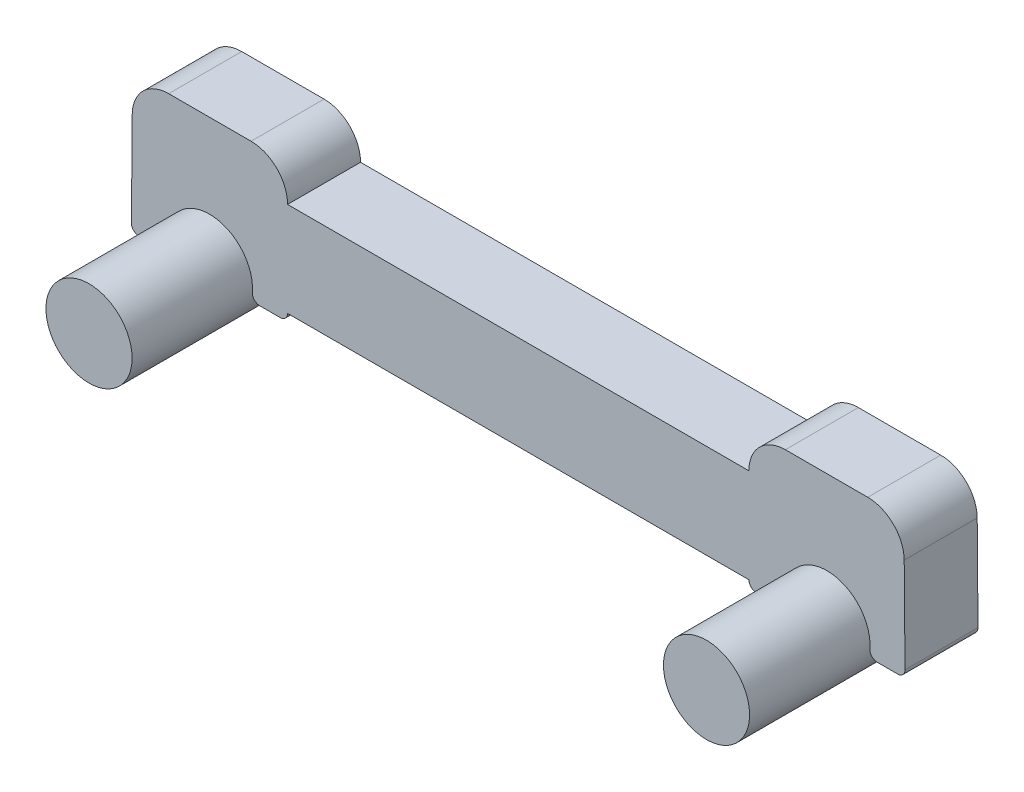
ISO-10303-21;
HEADER;
FILE_DESCRIPTION(('STEP AP214'),'2;1');
FILE_NAME('part.step','',(''),(''),'','','');
FILE_SCHEMA(('AUTOMOTIVE_DESIGN { 1 0 10303 214 1 1 1 1 }'));
ENDSEC;
DATA;
#1=APPLICATION_CONTEXT('core data for automotive mechanical design processes');
#2=APPLICATION_PROTOCOL_DEFINITION('international standard','automotive_design',2000,#1);
#3=PRODUCT_CONTEXT('',#1,'mechanical');
#4=PRODUCT('Part','Part','',(#3));
#5=PRODUCT_RELATED_PRODUCT_CATEGORY('part','',(#4));
#6=PRODUCT_DEFINITION_FORMATION('','',#4);
#7=PRODUCT_DEFINITION_CONTEXT('part definition',#1,'design');
#8=PRODUCT_DEFINITION('design','',#6,#7);
#9=PRODUCT_DEFINITION_SHAPE('','',#8);
#10=(LENGTH_UNIT() NAMED_UNIT(*) SI_UNIT(.MILLI.,.METRE.));
#11=(NAMED_UNIT(*) PLANE_ANGLE_UNIT() SI_UNIT($,.RADIAN.));
#12=(NAMED_UNIT(*) SI_UNIT($,.STERADIAN.) SOLID_ANGLE_UNIT());
#13=UNCERTAINTY_MEASURE_WITH_UNIT(LENGTH_MEASURE(1.E-05),#10,'distance_accuracy_value','');
#14=(GEOMETRIC_REPRESENTATION_CONTEXT(3) GLOBAL_UNCERTAINTY_ASSIGNED_CONTEXT((#13)) GLOBAL_UNIT_ASSIGNED_CONTEXT((#10,
#11,#12)) REPRESENTATION_CONTEXT('',''));
#15=CARTESIAN_POINT('',(0.,0.,0.));
#16=DIRECTION('',(0.,0.,1.));
#17=DIRECTION('',(1.,0.,0.));
#18=AXIS2_PLACEMENT_3D('',#15,#16,#17);
#19=CARTESIAN_POINT('',(0.,0.,6.731));
#20=DIRECTION('',(0.,0.,-1.));
#21=DIRECTION('',(-1.,0.,0.));
#22=AXIS2_PLACEMENT_3D('',#19,#20,#21);
#23=CYLINDRICAL_SURFACE('',#22,1.4986);
#24=CARTESIAN_POINT('',(0.,0.,2.54));
#25=DIRECTION('',(0.,0.,1.));
#26=DIRECTION('',(1.,0.,0.));
#27=AXIS2_PLACEMENT_3D('',#24,#25,#26);
#28=CIRCLE('',#27,1.4986);
#29=CARTESIAN_POINT('',(1.49422208879911,-0.114465319397793,2.54));
#30=VERTEX_POINT('',#29);
#31=CARTESIAN_POINT('',(-1.49422208879911,-0.114465319397793,2.54));
#32=VERTEX_POINT('',#31);
#33=EDGE_CURVE('E64',#30,#32,#28,.T.);
#34=ORIENTED_EDGE('',*,*,#33,.T.);
#35=DIRECTION('',(0.,0.,-1.));
#36=VECTOR('',#35,1.);
#37=CARTESIAN_POINT('',(-1.49422208879911,-0.114465319397793,2.54));
#38=LINE('',#37,#36);
#39=CARTESIAN_POINT('',(-1.49422208879911,-0.114465319397793,0.));
#40=VERTEX_POINT('',#39);
#41=EDGE_CURVE('E435',#32,#40,#38,.T.);
#42=ORIENTED_EDGE('',*,*,#41,.T.);
#43=CARTESIAN_POINT('',(0.,0.,0.));
#44=DIRECTION('',(0.,0.,1.));
#45=DIRECTION('',(1.,0.,0.));
#46=AXIS2_PLACEMENT_3D('',#43,#44,#45);
#47=CIRCLE('',#46,1.4986);
#48=CARTESIAN_POINT('',(1.49422208879911,-0.114465319397793,0.));
#49=VERTEX_POINT('',#48);
#50=EDGE_CURVE('E48',#40,#49,#47,.T.);
#51=ORIENTED_EDGE('',*,*,#50,.T.);
#52=DIRECTION('',(0.,0.,-1.));
#53=VECTOR('',#52,1.);
#54=CARTESIAN_POINT('',(1.49422208879911,-0.114465319397793,2.54));
#55=LINE('',#54,#53);
#56=EDGE_CURVE('E60',#30,#49,#55,.T.);
#57=ORIENTED_EDGE('',*,*,#56,.F.);
#58=EDGE_LOOP('',(#34,#42,#51,#57));
#59=FACE_BOUND('',#58,.T.);
#60=CARTESIAN_POINT('',(0.,0.,6.731));
#61=DIRECTION('',(0.,0.,1.));
#62=DIRECTION('',(1.,0.,0.));
#63=AXIS2_PLACEMENT_3D('',#60,#61,#62);
#64=CIRCLE('',#63,1.4986);
#65=CARTESIAN_POINT('',(1.4986,0.,6.731));
#66=VERTEX_POINT('',#65);
#67=EDGE_CURVE('E11',#66,#66,#64,.T.);
#68=ORIENTED_EDGE('',*,*,#67,.F.);
#69=EDGE_LOOP('',(#68));
#70=FACE_BOUND('',#69,.T.);
#71=ADVANCED_FACE('F45',(#59,#70),#23,.T.);
#72=CARTESIAN_POINT('',(0.,0.,6.731));
#73=DIRECTION('',(0.,0.,1.));
#74=DIRECTION('',(1.,0.,0.));
#75=AXIS2_PLACEMENT_3D('',#72,#73,#74);
#76=PLANE('',#75);
#77=ORIENTED_EDGE('',*,*,#67,.T.);
#78=EDGE_LOOP('',(#77));
#79=FACE_BOUND('',#78,.T.);
#80=ADVANCED_FACE('F563',(#79),#76,.T.);
#81=CARTESIAN_POINT('',(0.,0.,0.));
#82=DIRECTION('',(0.,0.,1.));
#83=DIRECTION('',(1.,0.,0.));
#84=AXIS2_PLACEMENT_3D('',#81,#82,#83);
#85=PLANE('',#84);
#86=ORIENTED_EDGE('',*,*,#50,.F.);
#87=CARTESIAN_POINT('',(-1.7474800699515,-0.133866220990639,0.));
#88=DIRECTION('',(0.,0.,-1.));
#89=DIRECTION('',(1.,0.,0.));
#90=AXIS2_PLACEMENT_3D('',#87,#88,#89);
#91=CIRCLE('',#90,0.254);
#92=CARTESIAN_POINT('',(-1.7474800699515,-0.387866220990639,0.));
#93=VERTEX_POINT('',#92);
#94=EDGE_CURVE('E422',#40,#93,#91,.T.);
#95=ORIENTED_EDGE('',*,*,#94,.T.);
#96=DIRECTION('',(-1.,0.,0.));
#97=VECTOR('',#96,1.);
#98=CARTESIAN_POINT('',(-1.7474800699515,-0.387866220990639,0.));
#99=LINE('',#98,#97);
#100=CARTESIAN_POINT('',(-2.46140392253097,-0.387866220990639,0.));
#101=VERTEX_POINT('',#100);
#102=EDGE_CURVE('E355',#93,#101,#99,.T.);
#103=ORIENTED_EDGE('',*,*,#102,.T.);
#104=CARTESIAN_POINT('',(-2.46140392253097,-0.133866220990639,0.));
#105=DIRECTION('',(0.,0.,-1.));
#106=DIRECTION('',(-1.,0.,0.));
#107=AXIS2_PLACEMENT_3D('',#104,#105,#106);
#108=CIRCLE('',#107,0.254);
#109=CARTESIAN_POINT('',(-2.71539504531815,-0.131742651988495,0.));
#110=VERTEX_POINT('',#109);
#111=EDGE_CURVE('E349',#101,#110,#108,.T.);
#112=ORIENTED_EDGE('',*,*,#111,.T.);
#113=DIRECTION('',(0.00836050788245017,0.999965050343235,0.));
#114=VECTOR('',#113,1.);
#115=CARTESIAN_POINT('',(-2.71539504531815,-0.131742651988495,0.));
#116=LINE('',#115,#114);
#117=CARTESIAN_POINT('',(-2.68787162170007,3.1602178450107,0.));
#118=VERTEX_POINT('',#117);
#119=EDGE_CURVE('E394',#110,#118,#116,.T.);
#120=ORIENTED_EDGE('',*,*,#119,.T.);
#121=CARTESIAN_POINT('',(-1.41791600776416,3.1496,0.));
#122=DIRECTION('',(0.,0.,-1.));
#123=DIRECTION('',(1.,0.,0.));
#124=AXIS2_PLACEMENT_3D('',#121,#122,#123);
#125=CIRCLE('',#124,1.27);
#126=CARTESIAN_POINT('',(-1.41791600776415,4.4196,0.));
#127=VERTEX_POINT('',#126);
#128=EDGE_CURVE('E398',#118,#127,#125,.T.);
#129=ORIENTED_EDGE('',*,*,#128,.T.);
#130=DIRECTION('',(1.,0.,0.));
#131=VECTOR('',#130,1.);
#132=CARTESIAN_POINT('',(1.44753644327679,4.4196,0.));
#133=LINE('',#132,#131);
#134=CARTESIAN_POINT('',(1.44753644327679,4.4196,0.));
#135=VERTEX_POINT('',#134);
#136=EDGE_CURVE('E402',#127,#135,#133,.T.);
#137=ORIENTED_EDGE('',*,*,#136,.T.);
#138=CARTESIAN_POINT('',(1.4475364432768,3.1496,0.));
#139=DIRECTION('',(0.,0.,-1.));
#140=DIRECTION('',(1.,0.,0.));
#141=AXIS2_PLACEMENT_3D('',#138,#139,#140);
#142=CIRCLE('',#141,1.27);
#143=CARTESIAN_POINT('',(2.7175364432768,3.14959999999999,0.));
#144=VERTEX_POINT('',#143);
#145=EDGE_CURVE('E406',#135,#144,#142,.T.);
#146=ORIENTED_EDGE('',*,*,#145,.T.);
#147=DIRECTION('',(-1.,0.,0.));
#148=VECTOR('',#147,1.);
#149=CARTESIAN_POINT('',(10.7439364432768,3.14959999999999,0.));
#150=LINE('',#149,#148);
#151=CARTESIAN_POINT('',(18.7703364432768,3.14959999999999,0.));
#152=VERTEX_POINT('',#151);
#153=EDGE_CURVE('E345',#152,#144,#150,.T.);
#154=ORIENTED_EDGE('',*,*,#153,.F.);
#155=CARTESIAN_POINT('',(20.0403364432768,3.1496,0.));
#156=DIRECTION('',(0.,0.,1.));
#157=DIRECTION('',(-1.,0.,0.));
#158=AXIS2_PLACEMENT_3D('',#155,#156,#157);
#159=CIRCLE('',#158,1.27);
#160=CARTESIAN_POINT('',(20.0403364432768,4.4196,0.));
#161=VERTEX_POINT('',#160);
#162=EDGE_CURVE('E276',#161,#152,#159,.T.);
#163=ORIENTED_EDGE('',*,*,#162,.F.);
#164=DIRECTION('',(-1.,0.,0.));
#165=VECTOR('',#164,1.);
#166=CARTESIAN_POINT('',(20.0403364432768,4.4196,0.));
#167=LINE('',#166,#165);
#168=CARTESIAN_POINT('',(22.9057888943177,4.4196,0.));
#169=VERTEX_POINT('',#168);
#170=EDGE_CURVE('E272',#169,#161,#167,.T.);
#171=ORIENTED_EDGE('',*,*,#170,.F.);
#172=CARTESIAN_POINT('',(22.9057888943177,3.1496,0.));
#173=DIRECTION('',(0.,0.,1.));
#174=DIRECTION('',(-1.,0.,0.));
#175=AXIS2_PLACEMENT_3D('',#172,#173,#174);
#176=CIRCLE('',#175,1.27);
#177=CARTESIAN_POINT('',(24.1757445082537,3.1602178450107,0.));
#178=VERTEX_POINT('',#177);
#179=EDGE_CURVE('E268',#178,#169,#176,.T.);
#180=ORIENTED_EDGE('',*,*,#179,.F.);
#181=DIRECTION('',(-0.00836050788245017,0.999965050343235,0.));
#182=VECTOR('',#181,1.);
#183=CARTESIAN_POINT('',(24.2032679318717,-0.131742651988495,0.));
#184=LINE('',#183,#182);
#185=CARTESIAN_POINT('',(24.2032679318717,-0.131742651988495,0.));
#186=VERTEX_POINT('',#185);
#187=EDGE_CURVE('E264',#186,#178,#184,.T.);
#188=ORIENTED_EDGE('',*,*,#187,.F.);
#189=CARTESIAN_POINT('',(23.9492768090846,-0.133866220990639,0.));
#190=DIRECTION('',(0.,0.,1.));
#191=DIRECTION('',(1.,0.,0.));
#192=AXIS2_PLACEMENT_3D('',#189,#190,#191);
#193=CIRCLE('',#192,0.254);
#194=CARTESIAN_POINT('',(23.9492768090846,-0.387866220990639,0.));
#195=VERTEX_POINT('',#194);
#196=EDGE_CURVE('E260',#195,#186,#193,.T.);
#197=ORIENTED_EDGE('',*,*,#196,.F.);
#198=DIRECTION('',(1.,0.,0.));
#199=VECTOR('',#198,1.);
#200=CARTESIAN_POINT('',(23.2353529565051,-0.387866220990639,0.));
#201=LINE('',#200,#199);
#202=CARTESIAN_POINT('',(23.2353529565051,-0.387866220990639,0.));
#203=VERTEX_POINT('',#202);
#204=EDGE_CURVE('E294',#203,#195,#201,.T.);
#205=ORIENTED_EDGE('',*,*,#204,.F.);
#206=CARTESIAN_POINT('',(23.2353529565051,-0.133866220990639,0.));
#207=DIRECTION('',(0.,0.,1.));
#208=DIRECTION('',(-1.,0.,0.));
#209=AXIS2_PLACEMENT_3D('',#206,#207,#208);
#210=CIRCLE('',#209,0.254);
#211=CARTESIAN_POINT('',(22.9820949753527,-0.114465319397793,0.));
#212=VERTEX_POINT('',#211);
#213=EDGE_CURVE('E290',#212,#203,#210,.T.);
#214=ORIENTED_EDGE('',*,*,#213,.F.);
#215=CARTESIAN_POINT('',(21.4878728865536,0.,0.));
#216=DIRECTION('',(0.,0.,-1.));
#217=DIRECTION('',(-1.,0.,0.));
#218=AXIS2_PLACEMENT_3D('',#215,#216,#217);
#219=CIRCLE('',#218,1.4986);
#220=CARTESIAN_POINT('',(19.9936507977545,-0.114465319397793,0.));
#221=VERTEX_POINT('',#220);
#222=EDGE_CURVE('E302',#212,#221,#219,.T.);
#223=ORIENTED_EDGE('',*,*,#222,.T.);
#224=CARTESIAN_POINT('',(19.7403928166021,-0.133866220990639,0.));
#225=DIRECTION('',(0.,0.,1.));
#226=DIRECTION('',(1.,0.,0.));
#227=AXIS2_PLACEMENT_3D('',#224,#225,#226);
#228=CIRCLE('',#227,0.254);
#229=CARTESIAN_POINT('',(19.7403928166021,-0.387866220990639,0.));
#230=VERTEX_POINT('',#229);
#231=EDGE_CURVE('E287',#230,#221,#228,.T.);
#232=ORIENTED_EDGE('',*,*,#231,.F.);
#233=DIRECTION('',(1.,0.,0.));
#234=VECTOR('',#233,1.);
#235=CARTESIAN_POINT('',(19.7403928166021,-0.387866220990639,0.));
#236=LINE('',#235,#234);
#237=CARTESIAN_POINT('',(19.0243364432768,-0.387866220990639,0.));
#238=VERTEX_POINT('',#237);
#239=EDGE_CURVE('E283',#238,#230,#236,.T.);
#240=ORIENTED_EDGE('',*,*,#239,.F.);
#241=CARTESIAN_POINT('',(19.0243364432768,-0.133866220990639,0.));
#242=DIRECTION('',(0.,0.,1.));
#243=DIRECTION('',(-1.,0.,0.));
#244=AXIS2_PLACEMENT_3D('',#241,#242,#243);
#245=CIRCLE('',#244,0.254);
#246=CARTESIAN_POINT('',(18.7703364432768,-0.133866220990639,0.));
#247=VERTEX_POINT('',#246);
#248=EDGE_CURVE('E280',#247,#238,#245,.T.);
#249=ORIENTED_EDGE('',*,*,#248,.F.);
#250=DIRECTION('',(-1.,0.,0.));
#251=VECTOR('',#250,1.);
#252=CARTESIAN_POINT('',(10.7439364432768,-0.133866220990639,0.));
#253=LINE('',#252,#251);
#254=CARTESIAN_POINT('',(2.7175364432768,-0.133866220990639,0.));
#255=VERTEX_POINT('',#254);
#256=EDGE_CURVE('E219',#247,#255,#253,.T.);
#257=ORIENTED_EDGE('',*,*,#256,.T.);
#258=CARTESIAN_POINT('',(2.4635364432768,-0.133866220990639,0.));
#259=DIRECTION('',(0.,0.,-1.));
#260=DIRECTION('',(1.,0.,0.));
#261=AXIS2_PLACEMENT_3D('',#258,#259,#260);
#262=CIRCLE('',#261,0.254);
#263=CARTESIAN_POINT('',(2.4635364432768,-0.387866220990639,0.));
#264=VERTEX_POINT('',#263);
#265=EDGE_CURVE('E410',#255,#264,#262,.T.);
#266=ORIENTED_EDGE('',*,*,#265,.T.);
#267=DIRECTION('',(-1.,0.,0.));
#268=VECTOR('',#267,1.);
#269=CARTESIAN_POINT('',(1.7474800699515,-0.387866220990639,0.));
#270=LINE('',#269,#268);
#271=CARTESIAN_POINT('',(1.7474800699515,-0.387866220990639,0.));
#272=VERTEX_POINT('',#271);
#273=EDGE_CURVE('E414',#264,#272,#270,.T.);
#274=ORIENTED_EDGE('',*,*,#273,.T.);
#275=CARTESIAN_POINT('',(1.7474800699515,-0.133866220990639,0.));
#276=DIRECTION('',(0.,0.,-1.));
#277=DIRECTION('',(-1.,0.,0.));
#278=AXIS2_PLACEMENT_3D('',#275,#276,#277);
#279=CIRCLE('',#278,0.254);
#280=EDGE_CURVE('E418',#272,#49,#279,.T.);
#281=ORIENTED_EDGE('',*,*,#280,.T.);
#282=EDGE_LOOP('',(#86,#95,#103,#112,#120,#129,#137,#146,#154,#163,#171,#180,#188,#197,#205,
#214,#223,#232,#240,#249,#257,#266,#274,#281));
#283=FACE_BOUND('',#282,.T.);
#284=ADVANCED_FACE('F471',(#283),#85,.F.);
#285=CARTESIAN_POINT('',(-2.46140392253097,-0.133866220990639,2.54));
#286=DIRECTION('',(0.,0.,-1.));
#287=DIRECTION('',(-1.,0.,0.));
#288=AXIS2_PLACEMENT_3D('',#285,#286,#287);
#289=CYLINDRICAL_SURFACE('',#288,0.254);
#290=ORIENTED_EDGE('',*,*,#111,.F.);
#291=DIRECTION('',(0.,0.,-1.));
#292=VECTOR('',#291,1.);
#293=CARTESIAN_POINT('',(-2.46140392253097,-0.387866220990639,2.54));
#294=LINE('',#293,#292);
#295=CARTESIAN_POINT('',(-2.46140392253097,-0.387866220990639,2.54));
#296=VERTEX_POINT('',#295);
#297=EDGE_CURVE('E429',#296,#101,#294,.T.);
#298=ORIENTED_EDGE('',*,*,#297,.F.);
#299=CARTESIAN_POINT('',(-2.46140392253097,-0.133866220990639,2.54));
#300=DIRECTION('',(0.,0.,-1.));
#301=DIRECTION('',(-1.,0.,0.));
#302=AXIS2_PLACEMENT_3D('',#299,#300,#301);
#303=CIRCLE('',#302,0.254);
#304=CARTESIAN_POINT('',(-2.71539504531815,-0.131742651988495,2.54));
#305=VERTEX_POINT('',#304);
#306=EDGE_CURVE('E350',#296,#305,#303,.T.);
#307=ORIENTED_EDGE('',*,*,#306,.T.);
#308=DIRECTION('',(0.,0.,-1.));
#309=VECTOR('',#308,1.);
#310=CARTESIAN_POINT('',(-2.71539504531815,-0.131742651988495,2.54));
#311=LINE('',#310,#309);
#312=EDGE_CURVE('E390',#305,#110,#311,.T.);
#313=ORIENTED_EDGE('',*,*,#312,.T.);
#314=EDGE_LOOP('',(#290,#298,#307,#313));
#315=FACE_BOUND('',#314,.T.);
#316=ADVANCED_FACE('F465',(#315),#289,.T.);
#317=CARTESIAN_POINT('',(-1.7474800699515,-0.387866220990639,2.54));
#318=DIRECTION('',(0.,-1.,0.));
#319=DIRECTION('',(0.,0.,-1.));
#320=AXIS2_PLACEMENT_3D('',#317,#318,#319);
#321=PLANE('',#320);
#322=ORIENTED_EDGE('',*,*,#102,.F.);
#323=DIRECTION('',(0.,0.,-1.));
#324=VECTOR('',#323,1.);
#325=CARTESIAN_POINT('',(-1.7474800699515,-0.387866220990639,2.54));
#326=LINE('',#325,#324);
#327=CARTESIAN_POINT('',(-1.7474800699515,-0.387866220990639,2.54));
#328=VERTEX_POINT('',#327);
#329=EDGE_CURVE('E432',#328,#93,#326,.T.);
#330=ORIENTED_EDGE('',*,*,#329,.F.);
#331=DIRECTION('',(-1.,0.,0.));
#332=VECTOR('',#331,1.);
#333=CARTESIAN_POINT('',(-1.7474800699515,-0.387866220990639,2.54));
#334=LINE('',#333,#332);
#335=EDGE_CURVE('E386',#328,#296,#334,.T.);
#336=ORIENTED_EDGE('',*,*,#335,.T.);
#337=ORIENTED_EDGE('',*,*,#297,.T.);
#338=EDGE_LOOP('',(#322,#330,#336,#337));
#339=FACE_BOUND('',#338,.T.);
#340=ADVANCED_FACE('F475',(#339),#321,.T.);
#341=CARTESIAN_POINT('',(-1.7474800699515,-0.133866220990639,2.54));
#342=DIRECTION('',(0.,0.,-1.));
#343=DIRECTION('',(-1.,0.,0.));
#344=AXIS2_PLACEMENT_3D('',#341,#342,#343);
#345=CYLINDRICAL_SURFACE('',#344,0.254);
#346=ORIENTED_EDGE('',*,*,#94,.F.);
#347=ORIENTED_EDGE('',*,*,#41,.F.);
#348=CARTESIAN_POINT('',(-1.7474800699515,-0.133866220990639,2.54));
#349=DIRECTION('',(0.,0.,-1.));
#350=DIRECTION('',(1.,0.,0.));
#351=AXIS2_PLACEMENT_3D('',#348,#349,#350);
#352=CIRCLE('',#351,0.254);
#353=EDGE_CURVE('E382',#32,#328,#352,.T.);
#354=ORIENTED_EDGE('',*,*,#353,.T.);
#355=ORIENTED_EDGE('',*,*,#329,.T.);
#356=EDGE_LOOP('',(#346,#347,#354,#355));
#357=FACE_BOUND('',#356,.T.);
#358=ADVANCED_FACE('F553',(#357),#345,.T.);
#359=CARTESIAN_POINT('',(1.7474800699515,-0.133866220990639,2.54));
#360=DIRECTION('',(0.,0.,-1.));
#361=DIRECTION('',(-1.,0.,0.));
#362=AXIS2_PLACEMENT_3D('',#359,#360,#361);
#363=CYLINDRICAL_SURFACE('',#362,0.254);
#364=ORIENTED_EDGE('',*,*,#280,.F.);
#365=DIRECTION('',(0.,0.,-1.));
#366=VECTOR('',#365,1.);
#367=CARTESIAN_POINT('',(1.7474800699515,-0.387866220990639,2.54));
#368=LINE('',#367,#366);
#369=CARTESIAN_POINT('',(1.7474800699515,-0.387866220990639,2.54));
#370=VERTEX_POINT('',#369);
#371=EDGE_CURVE('E440',#370,#272,#368,.T.);
#372=ORIENTED_EDGE('',*,*,#371,.F.);
#373=CARTESIAN_POINT('',(1.7474800699515,-0.133866220990639,2.54));
#374=DIRECTION('',(0.,0.,-1.));
#375=DIRECTION('',(-1.,0.,0.));
#376=AXIS2_PLACEMENT_3D('',#373,#374,#375);
#377=CIRCLE('',#376,0.254);
#378=EDGE_CURVE('E376',#370,#30,#377,.T.);
#379=ORIENTED_EDGE('',*,*,#378,.T.);
#380=ORIENTED_EDGE('',*,*,#56,.T.);
#381=EDGE_LOOP('',(#364,#372,#379,#380));
#382=FACE_BOUND('',#381,.T.);
#383=ADVANCED_FACE('F549',(#382),#363,.T.);
#384=CARTESIAN_POINT('',(1.7474800699515,-0.387866220990639,2.54));
#385=DIRECTION('',(0.,-1.,0.));
#386=DIRECTION('',(1.,0.,0.));
#387=AXIS2_PLACEMENT_3D('',#384,#385,#386);
#388=PLANE('',#387);
#389=ORIENTED_EDGE('',*,*,#273,.F.);
#390=DIRECTION('',(0.,0.,-1.));
#391=VECTOR('',#390,1.);
#392=CARTESIAN_POINT('',(2.4635364432768,-0.387866220990639,2.54));
#393=LINE('',#392,#391);
#394=CARTESIAN_POINT('',(2.4635364432768,-0.387866220990639,2.54));
#395=VERTEX_POINT('',#394);
#396=EDGE_CURVE('E443',#395,#264,#393,.T.);
#397=ORIENTED_EDGE('',*,*,#396,.F.);
#398=DIRECTION('',(-1.,0.,0.));
#399=VECTOR('',#398,1.);
#400=CARTESIAN_POINT('',(1.7474800699515,-0.387866220990639,2.54));
#401=LINE('',#400,#399);
#402=EDGE_CURVE('E372',#395,#370,#401,.T.);
#403=ORIENTED_EDGE('',*,*,#402,.T.);
#404=ORIENTED_EDGE('',*,*,#371,.T.);
#405=EDGE_LOOP('',(#389,#397,#403,#404));
#406=FACE_BOUND('',#405,.T.);
#407=ADVANCED_FACE('F545',(#406),#388,.T.);
#408=CARTESIAN_POINT('',(2.4635364432768,-0.133866220990639,2.54));
#409=DIRECTION('',(0.,0.,-1.));
#410=DIRECTION('',(-1.,0.,0.));
#411=AXIS2_PLACEMENT_3D('',#408,#409,#410);
#412=CYLINDRICAL_SURFACE('',#411,0.254);
#413=ORIENTED_EDGE('',*,*,#265,.F.);
#414=DIRECTION('',(0.,0.,-1.));
#415=VECTOR('',#414,1.);
#416=CARTESIAN_POINT('',(2.7175364432768,-0.133866220990639,2.54));
#417=LINE('',#416,#415);
#418=CARTESIAN_POINT('',(2.7175364432768,-0.133866220990639,2.54));
#419=VERTEX_POINT('',#418);
#420=EDGE_CURVE('E446',#419,#255,#417,.T.);
#421=ORIENTED_EDGE('',*,*,#420,.F.);
#422=CARTESIAN_POINT('',(2.4635364432768,-0.133866220990639,2.54));
#423=DIRECTION('',(0.,0.,-1.));
#424=DIRECTION('',(1.,0.,0.));
#425=AXIS2_PLACEMENT_3D('',#422,#423,#424);
#426=CIRCLE('',#425,0.254);
#427=EDGE_CURVE('E213',#419,#395,#426,.T.);
#428=ORIENTED_EDGE('',*,*,#427,.T.);
#429=ORIENTED_EDGE('',*,*,#396,.T.);
#430=EDGE_LOOP('',(#413,#421,#428,#429));
#431=FACE_BOUND('',#430,.T.);
#432=ADVANCED_FACE('F543',(#431),#412,.T.);
#433=CARTESIAN_POINT('',(1.4475364432768,3.1496,2.54));
#434=DIRECTION('',(0.,0.,-1.));
#435=DIRECTION('',(-1.,0.,0.));
#436=AXIS2_PLACEMENT_3D('',#433,#434,#435);
#437=CYLINDRICAL_SURFACE('',#436,1.27);
#438=ORIENTED_EDGE('',*,*,#145,.F.);
#439=DIRECTION('',(0.,0.,-1.));
#440=VECTOR('',#439,1.);
#441=CARTESIAN_POINT('',(1.44753644327679,4.4196,2.54));
#442=LINE('',#441,#440);
#443=CARTESIAN_POINT('',(1.44753644327679,4.4196,2.54));
#444=VERTEX_POINT('',#443);
#445=EDGE_CURVE('E452',#444,#135,#442,.T.);
#446=ORIENTED_EDGE('',*,*,#445,.F.);
#447=CARTESIAN_POINT('',(1.4475364432768,3.1496,2.54));
#448=DIRECTION('',(0.,0.,-1.));
#449=DIRECTION('',(1.,0.,0.));
#450=AXIS2_PLACEMENT_3D('',#447,#448,#449);
#451=CIRCLE('',#450,1.27);
#452=CARTESIAN_POINT('',(2.7175364432768,3.14959999999999,2.54));
#453=VERTEX_POINT('',#452);
#454=EDGE_CURVE('E367',#444,#453,#451,.T.);
#455=ORIENTED_EDGE('',*,*,#454,.T.);
#456=DIRECTION('',(0.,0.,-1.));
#457=VECTOR('',#456,1.);
#458=CARTESIAN_POINT('',(2.7175364432768,3.14959999999999,2.54));
#459=LINE('',#458,#457);
#460=EDGE_CURVE('E449',#453,#144,#459,.T.);
#461=ORIENTED_EDGE('',*,*,#460,.T.);
#462=EDGE_LOOP('',(#438,#446,#455,#461));
#463=FACE_BOUND('',#462,.T.);
#464=ADVANCED_FACE('F488',(#463),#437,.T.);
#465=CARTESIAN_POINT('',(1.44753644327679,4.4196,2.54));
#466=DIRECTION('',(0.,1.,0.));
#467=DIRECTION('',(0.,0.,1.));
#468=AXIS2_PLACEMENT_3D('',#465,#466,#467);
#469=PLANE('',#468);
#470=ORIENTED_EDGE('',*,*,#136,.F.);
#471=DIRECTION('',(0.,0.,-1.));
#472=VECTOR('',#471,1.);
#473=CARTESIAN_POINT('',(-1.41791600776415,4.4196,2.54));
#474=LINE('',#473,#472);
#475=CARTESIAN_POINT('',(-1.41791600776415,4.4196,2.54));
#476=VERTEX_POINT('',#475);
#477=EDGE_CURVE('E455',#476,#127,#474,.T.);
#478=ORIENTED_EDGE('',*,*,#477,.F.);
#479=DIRECTION('',(1.,0.,0.));
#480=VECTOR('',#479,1.);
#481=CARTESIAN_POINT('',(1.44753644327679,4.4196,2.54));
#482=LINE('',#481,#480);
#483=EDGE_CURVE('E363',#476,#444,#482,.T.);
#484=ORIENTED_EDGE('',*,*,#483,.T.);
#485=ORIENTED_EDGE('',*,*,#445,.T.);
#486=EDGE_LOOP('',(#470,#478,#484,#485));
#487=FACE_BOUND('',#486,.T.);
#488=ADVANCED_FACE('F486',(#487),#469,.T.);
#489=CARTESIAN_POINT('',(-1.41791600776416,3.1496,2.54));
#490=DIRECTION('',(0.,0.,-1.));
#491=DIRECTION('',(-1.,0.,0.));
#492=AXIS2_PLACEMENT_3D('',#489,#490,#491);
#493=CYLINDRICAL_SURFACE('',#492,1.27);
#494=ORIENTED_EDGE('',*,*,#128,.F.);
#495=DIRECTION('',(0.,0.,-1.));
#496=VECTOR('',#495,1.);
#497=CARTESIAN_POINT('',(-2.68787162170007,3.1602178450107,2.54));
#498=LINE('',#497,#496);
#499=CARTESIAN_POINT('',(-2.68787162170007,3.1602178450107,2.54));
#500=VERTEX_POINT('',#499);
#501=EDGE_CURVE('E458',#500,#118,#498,.T.);
#502=ORIENTED_EDGE('',*,*,#501,.F.);
#503=CARTESIAN_POINT('',(-1.41791600776416,3.1496,2.54));
#504=DIRECTION('',(0.,0.,-1.));
#505=DIRECTION('',(1.,0.,0.));
#506=AXIS2_PLACEMENT_3D('',#503,#504,#505);
#507=CIRCLE('',#506,1.27);
#508=EDGE_CURVE('E359',#500,#476,#507,.T.);
#509=ORIENTED_EDGE('',*,*,#508,.T.);
#510=ORIENTED_EDGE('',*,*,#477,.T.);
#511=EDGE_LOOP('',(#494,#502,#509,#510));
#512=FACE_BOUND('',#511,.T.);
#513=ADVANCED_FACE('F482',(#512),#493,.T.);
#514=CARTESIAN_POINT('',(-2.71539504531815,-0.131742651988495,2.54));
#515=DIRECTION('',(-0.999965050343234,0.00836050788245017,0.));
#516=DIRECTION('',(-0.00836050788245017,-0.999965050343235,0.));
#517=AXIS2_PLACEMENT_3D('',#514,#515,#516);
#518=PLANE('',#517);
#519=ORIENTED_EDGE('',*,*,#119,.F.);
#520=ORIENTED_EDGE('',*,*,#312,.F.);
#521=DIRECTION('',(0.00836050788245017,0.999965050343235,0.));
#522=VECTOR('',#521,1.);
#523=CARTESIAN_POINT('',(-2.71539504531815,-0.131742651988495,2.54));
#524=LINE('',#523,#522);
#525=EDGE_CURVE('E354',#305,#500,#524,.T.);
#526=ORIENTED_EDGE('',*,*,#525,.T.);
#527=ORIENTED_EDGE('',*,*,#501,.T.);
#528=EDGE_LOOP('',(#519,#520,#526,#527));
#529=FACE_BOUND('',#528,.T.);
#530=ADVANCED_FACE('F468',(#529),#518,.T.);
#531=CARTESIAN_POINT('',(-2.46140392253097,-0.133866220990639,2.54));
#532=DIRECTION('',(0.,0.,-1.));
#533=DIRECTION('',(-1.,0.,0.));
#534=AXIS2_PLACEMENT_3D('',#531,#532,#533);
#535=PLANE('',#534);
#536=ORIENTED_EDGE('',*,*,#306,.F.);
#537=ORIENTED_EDGE('',*,*,#335,.F.);
#538=ORIENTED_EDGE('',*,*,#353,.F.);
#539=ORIENTED_EDGE('',*,*,#33,.F.);
#540=ORIENTED_EDGE('',*,*,#378,.F.);
#541=ORIENTED_EDGE('',*,*,#402,.F.);
#542=ORIENTED_EDGE('',*,*,#427,.F.);
#543=DIRECTION('',(-1.,0.,0.));
#544=VECTOR('',#543,1.);
#545=CARTESIAN_POINT('',(10.7439364432768,-0.133866220990639,2.54));
#546=LINE('',#545,#544);
#547=CARTESIAN_POINT('',(18.7703364432768,-0.133866220990639,2.54));
#548=VERTEX_POINT('',#547);
#549=EDGE_CURVE('E204',#548,#419,#546,.T.);
#550=ORIENTED_EDGE('',*,*,#549,.F.);
#551=CARTESIAN_POINT('',(19.0243364432768,-0.133866220990639,2.54));
#552=DIRECTION('',(0.,0.,1.));
#553=DIRECTION('',(-1.,0.,0.));
#554=AXIS2_PLACEMENT_3D('',#551,#552,#553);
#555=CIRCLE('',#554,0.254);
#556=CARTESIAN_POINT('',(19.0243364432768,-0.387866220990639,2.54));
#557=VERTEX_POINT('',#556);
#558=EDGE_CURVE('E209',#548,#557,#555,.T.);
#559=ORIENTED_EDGE('',*,*,#558,.T.);
#560=DIRECTION('',(1.,0.,0.));
#561=VECTOR('',#560,1.);
#562=CARTESIAN_POINT('',(19.7403928166021,-0.387866220990639,2.54));
#563=LINE('',#562,#561);
#564=CARTESIAN_POINT('',(19.7403928166021,-0.387866220990639,2.54));
#565=VERTEX_POINT('',#564);
#566=EDGE_CURVE('E235',#557,#565,#563,.T.);
#567=ORIENTED_EDGE('',*,*,#566,.T.);
#568=CARTESIAN_POINT('',(19.7403928166021,-0.133866220990639,2.54));
#569=DIRECTION('',(0.,0.,1.));
#570=DIRECTION('',(1.,0.,0.));
#571=AXIS2_PLACEMENT_3D('',#568,#569,#570);
#572=CIRCLE('',#571,0.254);
#573=CARTESIAN_POINT('',(19.9936507977545,-0.114465319397793,2.54));
#574=VERTEX_POINT('',#573);
#575=EDGE_CURVE('E240',#565,#574,#572,.T.);
#576=ORIENTED_EDGE('',*,*,#575,.T.);
#577=CARTESIAN_POINT('',(21.4878728865536,0.,2.54));
#578=DIRECTION('',(0.,0.,-1.));
#579=DIRECTION('',(-1.,0.,0.));
#580=AXIS2_PLACEMENT_3D('',#577,#578,#579);
#581=CIRCLE('',#580,1.4986);
#582=CARTESIAN_POINT('',(22.9820949753527,-0.114465319397793,2.54));
#583=VERTEX_POINT('',#582);
#584=EDGE_CURVE('E249',#574,#583,#581,.T.);
#585=ORIENTED_EDGE('',*,*,#584,.T.);
#586=CARTESIAN_POINT('',(23.2353529565051,-0.133866220990639,2.54));
#587=DIRECTION('',(0.,0.,1.));
#588=DIRECTION('',(-1.,0.,0.));
#589=AXIS2_PLACEMENT_3D('',#586,#587,#588);
#590=CIRCLE('',#589,0.254);
#591=CARTESIAN_POINT('',(23.2353529565051,-0.387866220990639,2.54));
#592=VERTEX_POINT('',#591);
#593=EDGE_CURVE('E253',#583,#592,#590,.T.);
#594=ORIENTED_EDGE('',*,*,#593,.T.);
#595=DIRECTION('',(1.,0.,0.));
#596=VECTOR('',#595,1.);
#597=CARTESIAN_POINT('',(23.2353529565051,-0.387866220990639,2.54));
#598=LINE('',#597,#596);
#599=CARTESIAN_POINT('',(23.9492768090846,-0.387866220990639,2.54));
#600=VERTEX_POINT('',#599);
#601=EDGE_CURVE('E256',#592,#600,#598,.T.);
#602=ORIENTED_EDGE('',*,*,#601,.T.);
#603=CARTESIAN_POINT('',(23.9492768090846,-0.133866220990639,2.54));
#604=DIRECTION('',(0.,0.,1.));
#605=DIRECTION('',(1.,0.,0.));
#606=AXIS2_PLACEMENT_3D('',#603,#604,#605);
#607=CIRCLE('',#606,0.254);
#608=CARTESIAN_POINT('',(24.2032679318717,-0.131742651988495,2.54));
#609=VERTEX_POINT('',#608);
#610=EDGE_CURVE('E298',#600,#609,#607,.T.);
#611=ORIENTED_EDGE('',*,*,#610,.T.);
#612=DIRECTION('',(-0.00836050788245017,0.999965050343235,0.));
#613=VECTOR('',#612,1.);
#614=CARTESIAN_POINT('',(24.2032679318717,-0.131742651988495,2.54));
#615=LINE('',#614,#613);
#616=CARTESIAN_POINT('',(24.1757445082537,3.1602178450107,2.54));
#617=VERTEX_POINT('',#616);
#618=EDGE_CURVE('E812',#609,#617,#615,.T.);
#619=ORIENTED_EDGE('',*,*,#618,.T.);
#620=CARTESIAN_POINT('',(22.9057888943177,3.1496,2.54));
#621=DIRECTION('',(0.,0.,1.));
#622=DIRECTION('',(-1.,0.,0.));
#623=AXIS2_PLACEMENT_3D('',#620,#621,#622);
#624=CIRCLE('',#623,1.27);
#625=CARTESIAN_POINT('',(22.9057888943177,4.4196,2.54));
#626=VERTEX_POINT('',#625);
#627=EDGE_CURVE('E509',#617,#626,#624,.T.);
#628=ORIENTED_EDGE('',*,*,#627,.T.);
#629=DIRECTION('',(-1.,0.,0.));
#630=VECTOR('',#629,1.);
#631=CARTESIAN_POINT('',(20.0403364432768,4.4196,2.54));
#632=LINE('',#631,#630);
#633=CARTESIAN_POINT('',(20.0403364432768,4.4196,2.54));
#634=VERTEX_POINT('',#633);
#635=EDGE_CURVE('E243',#626,#634,#632,.T.);
#636=ORIENTED_EDGE('',*,*,#635,.T.);
#637=CARTESIAN_POINT('',(20.0403364432768,3.1496,2.54));
#638=DIRECTION('',(0.,0.,1.));
#639=DIRECTION('',(-1.,0.,0.));
#640=AXIS2_PLACEMENT_3D('',#637,#638,#639);
#641=CIRCLE('',#640,1.27);
#642=CARTESIAN_POINT('',(18.7703364432768,3.14959999999999,2.54));
#643=VERTEX_POINT('',#642);
#644=EDGE_CURVE('E236',#634,#643,#641,.T.);
#645=ORIENTED_EDGE('',*,*,#644,.T.);
#646=DIRECTION('',(-1.,0.,0.));
#647=VECTOR('',#646,1.);
#648=CARTESIAN_POINT('',(10.7439364432768,3.14959999999999,2.54));
#649=LINE('',#648,#647);
#650=EDGE_CURVE('E218',#643,#453,#649,.T.);
#651=ORIENTED_EDGE('',*,*,#650,.T.);
#652=ORIENTED_EDGE('',*,*,#454,.F.);
#653=ORIENTED_EDGE('',*,*,#483,.F.);
#654=ORIENTED_EDGE('',*,*,#508,.F.);
#655=ORIENTED_EDGE('',*,*,#525,.F.);
#656=EDGE_LOOP('',(#536,#537,#538,#539,#540,#541,#542,#550,#559,#567,#576,#585,#594,#602,#611,
#619,#628,#636,#645,#651,#652,#653,#654,#655));
#657=FACE_BOUND('',#656,.T.);
#658=ADVANCED_FACE('F207',(#657),#535,.F.);
#659=CARTESIAN_POINT('',(10.7439364432768,3.14959999999999,0.));
#660=DIRECTION('',(0.,-1.,0.));
#661=DIRECTION('',(0.,0.,-1.));
#662=AXIS2_PLACEMENT_3D('',#659,#660,#661);
#663=PLANE('',#662);
#664=ORIENTED_EDGE('',*,*,#460,.F.);
#665=ORIENTED_EDGE('',*,*,#650,.F.);
#666=DIRECTION('',(0.,0.,-1.));
#667=VECTOR('',#666,1.);
#668=CARTESIAN_POINT('',(18.7703364432768,3.14959999999999,2.54));
#669=LINE('',#668,#667);
#670=EDGE_CURVE('E230',#643,#152,#669,.T.);
#671=ORIENTED_EDGE('',*,*,#670,.T.);
#672=ORIENTED_EDGE('',*,*,#153,.T.);
#673=EDGE_LOOP('',(#664,#665,#671,#672));
#674=FACE_BOUND('',#673,.T.);
#675=ADVANCED_FACE('F491',(#674),#663,.F.);
#676=CARTESIAN_POINT('',(10.7439364432768,-0.133866220990639,0.));
#677=DIRECTION('',(0.,1.,0.));
#678=DIRECTION('',(0.,0.,1.));
#679=AXIS2_PLACEMENT_3D('',#676,#677,#678);
#680=PLANE('',#679);
#681=ORIENTED_EDGE('',*,*,#420,.T.);
#682=ORIENTED_EDGE('',*,*,#256,.F.);
#683=DIRECTION('',(0.,0.,-1.));
#684=VECTOR('',#683,1.);
#685=CARTESIAN_POINT('',(18.7703364432768,-0.133866220990639,2.54));
#686=LINE('',#685,#684);
#687=EDGE_CURVE('E222',#548,#247,#686,.T.);
#688=ORIENTED_EDGE('',*,*,#687,.F.);
#689=ORIENTED_EDGE('',*,*,#549,.T.);
#690=EDGE_LOOP('',(#681,#682,#688,#689));
#691=FACE_BOUND('',#690,.T.);
#692=ADVANCED_FACE('F223',(#691),#680,.F.);
#693=CARTESIAN_POINT('',(21.4878728865536,0.,6.731));
#694=DIRECTION('',(0.,0.,-1.));
#695=DIRECTION('',(1.,0.,0.));
#696=AXIS2_PLACEMENT_3D('',#693,#694,#695);
#697=CYLINDRICAL_SURFACE('',#696,1.4986);
#698=ORIENTED_EDGE('',*,*,#584,.F.);
#699=DIRECTION('',(0.,0.,-1.));
#700=VECTOR('',#699,1.);
#701=CARTESIAN_POINT('',(19.9936507977545,-0.114465319397793,2.54));
#702=LINE('',#701,#700);
#703=EDGE_CURVE('E310',#574,#221,#702,.T.);
#704=ORIENTED_EDGE('',*,*,#703,.T.);
#705=ORIENTED_EDGE('',*,*,#222,.F.);
#706=DIRECTION('',(0.,0.,-1.));
#707=VECTOR('',#706,1.);
#708=CARTESIAN_POINT('',(22.9820949753527,-0.114465319397793,2.54));
#709=LINE('',#708,#707);
#710=EDGE_CURVE('E306',#583,#212,#709,.T.);
#711=ORIENTED_EDGE('',*,*,#710,.F.);
#712=EDGE_LOOP('',(#698,#704,#705,#711));
#713=FACE_BOUND('',#712,.T.);
#714=CARTESIAN_POINT('',(21.4878728865536,0.,6.731));
#715=DIRECTION('',(0.,0.,-1.));
#716=DIRECTION('',(-1.,0.,0.));
#717=AXIS2_PLACEMENT_3D('',#714,#715,#716);
#718=CIRCLE('',#717,1.4986);
#719=CARTESIAN_POINT('',(19.9892728865536,0.,6.731));
#720=VERTEX_POINT('',#719);
#721=EDGE_CURVE('E333',#720,#720,#718,.T.);
#722=ORIENTED_EDGE('',*,*,#721,.T.);
#723=EDGE_LOOP('',(#722));
#724=FACE_BOUND('',#723,.T.);
#725=ADVANCED_FACE('F533',(#713,#724),#697,.T.);
#726=CARTESIAN_POINT('',(21.4878728865536,0.,6.731));
#727=DIRECTION('',(0.,0.,1.));
#728=DIRECTION('',(-1.,0.,0.));
#729=AXIS2_PLACEMENT_3D('',#726,#727,#728);
#730=PLANE('',#729);
#731=ORIENTED_EDGE('',*,*,#721,.F.);
#732=EDGE_LOOP('',(#731));
#733=FACE_BOUND('',#732,.T.);
#734=ADVANCED_FACE('F633',(#733),#730,.T.);
#735=CARTESIAN_POINT('',(23.9492768090846,-0.133866220990639,2.54));
#736=DIRECTION('',(0.,0.,-1.));
#737=DIRECTION('',(1.,0.,0.));
#738=AXIS2_PLACEMENT_3D('',#735,#736,#737);
#739=CYLINDRICAL_SURFACE('',#738,0.254);
#740=ORIENTED_EDGE('',*,*,#196,.T.);
#741=DIRECTION('',(0.,0.,-1.));
#742=VECTOR('',#741,1.);
#743=CARTESIAN_POINT('',(24.2032679318717,-0.131742651988495,2.54));
#744=LINE('',#743,#742);
#745=EDGE_CURVE('E259',#609,#186,#744,.T.);
#746=ORIENTED_EDGE('',*,*,#745,.F.);
#747=ORIENTED_EDGE('',*,*,#610,.F.);
#748=DIRECTION('',(0.,0.,-1.));
#749=VECTOR('',#748,1.);
#750=CARTESIAN_POINT('',(23.9492768090846,-0.387866220990639,2.54));
#751=LINE('',#750,#749);
#752=EDGE_CURVE('E299',#600,#195,#751,.T.);
#753=ORIENTED_EDGE('',*,*,#752,.T.);
#754=EDGE_LOOP('',(#740,#746,#747,#753));
#755=FACE_BOUND('',#754,.T.);
#756=ADVANCED_FACE('F516',(#755),#739,.T.);
#757=CARTESIAN_POINT('',(23.2353529565051,-0.387866220990639,2.54));
#758=DIRECTION('',(0.,-1.,0.));
#759=DIRECTION('',(0.,0.,-1.));
#760=AXIS2_PLACEMENT_3D('',#757,#758,#759);
#761=PLANE('',#760);
#762=ORIENTED_EDGE('',*,*,#204,.T.);
#763=ORIENTED_EDGE('',*,*,#752,.F.);
#764=ORIENTED_EDGE('',*,*,#601,.F.);
#765=DIRECTION('',(0.,0.,-1.));
#766=VECTOR('',#765,1.);
#767=CARTESIAN_POINT('',(23.2353529565051,-0.387866220990639,2.54));
#768=LINE('',#767,#766);
#769=EDGE_CURVE('E303',#592,#203,#768,.T.);
#770=ORIENTED_EDGE('',*,*,#769,.T.);
#771=EDGE_LOOP('',(#762,#763,#764,#770));
#772=FACE_BOUND('',#771,.T.);
#773=ADVANCED_FACE('F522',(#772),#761,.T.);
#774=CARTESIAN_POINT('',(23.2353529565051,-0.133866220990639,2.54));
#775=DIRECTION('',(0.,0.,-1.));
#776=DIRECTION('',(1.,0.,0.));
#777=AXIS2_PLACEMENT_3D('',#774,#775,#776);
#778=CYLINDRICAL_SURFACE('',#777,0.254);
#779=ORIENTED_EDGE('',*,*,#213,.T.);
#780=ORIENTED_EDGE('',*,*,#769,.F.);
#781=ORIENTED_EDGE('',*,*,#593,.F.);
#782=ORIENTED_EDGE('',*,*,#710,.T.);
#783=EDGE_LOOP('',(#779,#780,#781,#782));
#784=FACE_BOUND('',#783,.T.);
#785=ADVANCED_FACE('F525',(#784),#778,.T.);
#786=CARTESIAN_POINT('',(19.7403928166021,-0.133866220990639,2.54));
#787=DIRECTION('',(0.,0.,-1.));
#788=DIRECTION('',(1.,0.,0.));
#789=AXIS2_PLACEMENT_3D('',#786,#787,#788);
#790=CYLINDRICAL_SURFACE('',#789,0.254);
#791=ORIENTED_EDGE('',*,*,#231,.T.);
#792=ORIENTED_EDGE('',*,*,#703,.F.);
#793=ORIENTED_EDGE('',*,*,#575,.F.);
#794=DIRECTION('',(0.,0.,-1.));
#795=VECTOR('',#794,1.);
#796=CARTESIAN_POINT('',(19.7403928166021,-0.387866220990639,2.54));
#797=LINE('',#796,#795);
#798=EDGE_CURVE('E314',#565,#230,#797,.T.);
#799=ORIENTED_EDGE('',*,*,#798,.T.);
#800=EDGE_LOOP('',(#791,#792,#793,#799));
#801=FACE_BOUND('',#800,.T.);
#802=ADVANCED_FACE('F537',(#801),#790,.T.);
#803=CARTESIAN_POINT('',(19.7403928166021,-0.387866220990639,2.54));
#804=DIRECTION('',(0.,-1.,0.));
#805=DIRECTION('',(-1.,0.,0.));
#806=AXIS2_PLACEMENT_3D('',#803,#804,#805);
#807=PLANE('',#806);
#808=ORIENTED_EDGE('',*,*,#239,.T.);
#809=ORIENTED_EDGE('',*,*,#798,.F.);
#810=ORIENTED_EDGE('',*,*,#566,.F.);
#811=DIRECTION('',(0.,0.,-1.));
#812=VECTOR('',#811,1.);
#813=CARTESIAN_POINT('',(19.0243364432768,-0.387866220990639,2.54));
#814=LINE('',#813,#812);
#815=EDGE_CURVE('E229',#557,#238,#814,.T.);
#816=ORIENTED_EDGE('',*,*,#815,.T.);
#817=EDGE_LOOP('',(#808,#809,#810,#816));
#818=FACE_BOUND('',#817,.T.);
#819=ADVANCED_FACE('F540',(#818),#807,.T.);
#820=CARTESIAN_POINT('',(19.0243364432768,-0.133866220990639,2.54));
#821=DIRECTION('',(0.,0.,-1.));
#822=DIRECTION('',(1.,0.,0.));
#823=AXIS2_PLACEMENT_3D('',#820,#821,#822);
#824=CYLINDRICAL_SURFACE('',#823,0.254);
#825=ORIENTED_EDGE('',*,*,#248,.T.);
#826=ORIENTED_EDGE('',*,*,#815,.F.);
#827=ORIENTED_EDGE('',*,*,#558,.F.);
#828=ORIENTED_EDGE('',*,*,#687,.T.);
#829=EDGE_LOOP('',(#825,#826,#827,#828));
#830=FACE_BOUND('',#829,.T.);
#831=ADVANCED_FACE('F232',(#830),#824,.T.);
#832=CARTESIAN_POINT('',(20.0403364432768,3.1496,2.54));
#833=DIRECTION('',(0.,0.,-1.));
#834=DIRECTION('',(1.,0.,0.));
#835=AXIS2_PLACEMENT_3D('',#832,#833,#834);
#836=CYLINDRICAL_SURFACE('',#835,1.27);
#837=ORIENTED_EDGE('',*,*,#162,.T.);
#838=ORIENTED_EDGE('',*,*,#670,.F.);
#839=ORIENTED_EDGE('',*,*,#644,.F.);
#840=DIRECTION('',(0.,0.,-1.));
#841=VECTOR('',#840,1.);
#842=CARTESIAN_POINT('',(20.0403364432768,4.4196,2.54));
#843=LINE('',#842,#841);
#844=EDGE_CURVE('E322',#634,#161,#843,.T.);
#845=ORIENTED_EDGE('',*,*,#844,.T.);
#846=EDGE_LOOP('',(#837,#838,#839,#845));
#847=FACE_BOUND('',#846,.T.);
#848=ADVANCED_FACE('F497',(#847),#836,.T.);
#849=CARTESIAN_POINT('',(20.0403364432768,4.4196,2.54));
#850=DIRECTION('',(0.,1.,0.));
#851=DIRECTION('',(0.,0.,1.));
#852=AXIS2_PLACEMENT_3D('',#849,#850,#851);
#853=PLANE('',#852);
#854=ORIENTED_EDGE('',*,*,#170,.T.);
#855=ORIENTED_EDGE('',*,*,#844,.F.);
#856=ORIENTED_EDGE('',*,*,#635,.F.);
#857=DIRECTION('',(0.,0.,-1.));
#858=VECTOR('',#857,1.);
#859=CARTESIAN_POINT('',(22.9057888943177,4.4196,2.54));
#860=LINE('',#859,#858);
#861=EDGE_CURVE('E325',#626,#169,#860,.T.);
#862=ORIENTED_EDGE('',*,*,#861,.T.);
#863=EDGE_LOOP('',(#854,#855,#856,#862));
#864=FACE_BOUND('',#863,.T.);
#865=ADVANCED_FACE('F503',(#864),#853,.T.);
#866=CARTESIAN_POINT('',(22.9057888943177,3.1496,2.54));
#867=DIRECTION('',(0.,0.,-1.));
#868=DIRECTION('',(1.,0.,0.));
#869=AXIS2_PLACEMENT_3D('',#866,#867,#868);
#870=CYLINDRICAL_SURFACE('',#869,1.27);
#871=ORIENTED_EDGE('',*,*,#179,.T.);
#872=ORIENTED_EDGE('',*,*,#861,.F.);
#873=ORIENTED_EDGE('',*,*,#627,.F.);
#874=DIRECTION('',(0.,0.,-1.));
#875=VECTOR('',#874,1.);
#876=CARTESIAN_POINT('',(24.1757445082537,3.1602178450107,2.54));
#877=LINE('',#876,#875);
#878=EDGE_CURVE('E328',#617,#178,#877,.T.);
#879=ORIENTED_EDGE('',*,*,#878,.T.);
#880=EDGE_LOOP('',(#871,#872,#873,#879));
#881=FACE_BOUND('',#880,.T.);
#882=ADVANCED_FACE('F507',(#881),#870,.T.);
#883=CARTESIAN_POINT('',(24.2032679318717,-0.131742651988495,2.54));
#884=DIRECTION('',(0.999965050343234,0.00836050788245017,0.));
#885=DIRECTION('',(0.00836050788245017,-0.999965050343235,0.));
#886=AXIS2_PLACEMENT_3D('',#883,#884,#885);
#887=PLANE('',#886);
#888=ORIENTED_EDGE('',*,*,#187,.T.);
#889=ORIENTED_EDGE('',*,*,#878,.F.);
#890=ORIENTED_EDGE('',*,*,#618,.F.);
#891=ORIENTED_EDGE('',*,*,#745,.T.);
#892=EDGE_LOOP('',(#888,#889,#890,#891));
#893=FACE_BOUND('',#892,.T.);
#894=ADVANCED_FACE('F511',(#893),#887,.T.);
#895=CLOSED_SHELL('',(#71,#80,#284,#316,#340,#358,#383,#407,#432,#464,#488,#513,#530,#658,#675,
#692,#725,#734,#756,#773,#785,#802,#819,#831,#848,#865,#882,#894));
#896=MANIFOLD_SOLID_BREP('B2',#895);
#897=ADVANCED_BREP_SHAPE_REPRESENTATION('',(#18,#896),#14);
#898=SHAPE_DEFINITION_REPRESENTATION(#9,#897);
ENDSEC;
END-ISO-10303-21;
